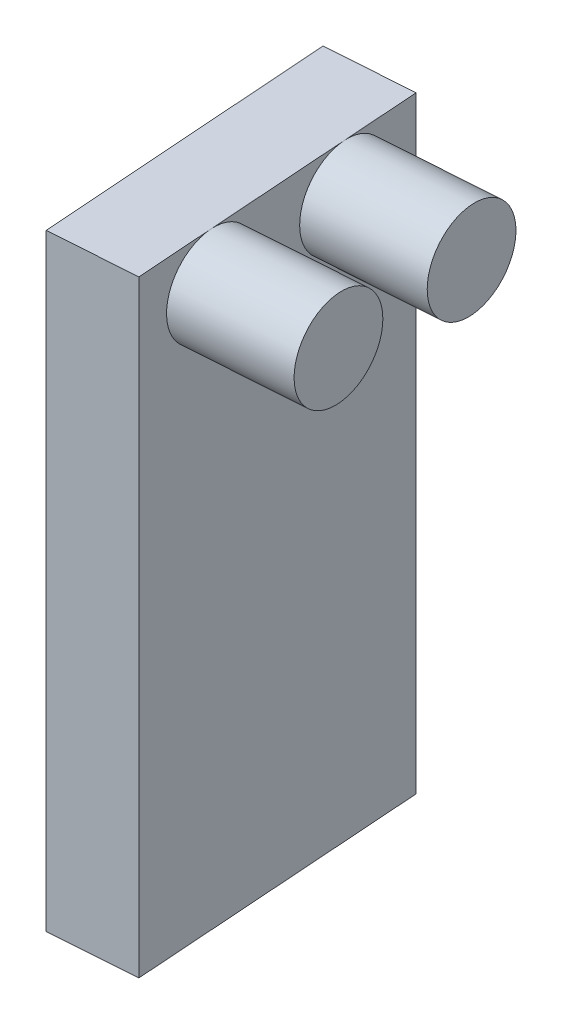
ISO-10303-21;
HEADER;
FILE_DESCRIPTION(('STEP AP214'),'2;1');
FILE_NAME('part.step','',(''),(''),'','','');
FILE_SCHEMA(('AUTOMOTIVE_DESIGN { 1 0 10303 214 1 1 1 1 }'));
ENDSEC;
DATA;
#1=APPLICATION_CONTEXT('core data for automotive mechanical design processes');
#2=APPLICATION_PROTOCOL_DEFINITION('international standard','automotive_design',2000,#1);
#3=PRODUCT_CONTEXT('',#1,'mechanical');
#4=PRODUCT('Part','Part','',(#3));
#5=PRODUCT_RELATED_PRODUCT_CATEGORY('part','',(#4));
#6=PRODUCT_DEFINITION_FORMATION('','',#4);
#7=PRODUCT_DEFINITION_CONTEXT('part definition',#1,'design');
#8=PRODUCT_DEFINITION('design','',#6,#7);
#9=PRODUCT_DEFINITION_SHAPE('','',#8);
#10=(LENGTH_UNIT() NAMED_UNIT(*) SI_UNIT(.MILLI.,.METRE.));
#11=(NAMED_UNIT(*) PLANE_ANGLE_UNIT() SI_UNIT($,.RADIAN.));
#12=(NAMED_UNIT(*) SI_UNIT($,.STERADIAN.) SOLID_ANGLE_UNIT());
#13=UNCERTAINTY_MEASURE_WITH_UNIT(LENGTH_MEASURE(1.E-05),#10,'distance_accuracy_value','');
#14=(GEOMETRIC_REPRESENTATION_CONTEXT(3) GLOBAL_UNCERTAINTY_ASSIGNED_CONTEXT((#13)) GLOBAL_UNIT_ASSIGNED_CONTEXT((#10,
#11,#12)) REPRESENTATION_CONTEXT('',''));
#15=CARTESIAN_POINT('',(0.,0.,0.));
#16=DIRECTION('',(0.,0.,1.));
#17=DIRECTION('',(1.,0.,0.));
#18=AXIS2_PLACEMENT_3D('',#15,#16,#17);
#19=CARTESIAN_POINT('',(0.,25.4,0.));
#20=DIRECTION('',(0.,1.,0.));
#21=DIRECTION('',(0.,0.,1.));
#22=AXIS2_PLACEMENT_3D('',#19,#20,#21);
#23=PLANE('',#22);
#24=DIRECTION('',(-0.0710028791074202,0.,-0.997476110570302));
#25=VECTOR('',#24,1.);
#26=CARTESIAN_POINT('',(130.455463612751,25.4,-9.28615072946733));
#27=LINE('',#26,#25);
#28=CARTESIAN_POINT('',(127.78747707898,25.4,-46.7670650841414));
#29=VERTEX_POINT('',#28);
#30=CARTESIAN_POINT('',(126.899940215872,25.4,-59.2355287482866));
#31=VERTEX_POINT('',#30);
#32=EDGE_CURVE('E55',#29,#31,#27,.T.);
#33=ORIENTED_EDGE('',*,*,#32,.F.);
#34=DIRECTION('',(0.997574787627234,0.,-0.069602752032367));
#35=VECTOR('',#34,1.);
#36=CARTESIAN_POINT('',(131.411983767772,25.4,-47.0199540338509));
#37=LINE('',#36,#35);
#38=CARTESIAN_POINT('',(131.411983767772,25.4,-47.0199540338509));
#39=VERTEX_POINT('',#38);
#40=EDGE_CURVE('E115',#29,#39,#37,.T.);
#41=ORIENTED_EDGE('',*,*,#40,.T.);
#42=DIRECTION('',(-0.0696027520323694,0.,-0.997574787627234));
#43=VECTOR('',#42,1.);
#44=CARTESIAN_POINT('',(130.541949367367,25.4,-59.4896388791913));
#45=LINE('',#44,#43);
#46=CARTESIAN_POINT('',(131.185774823667,25.4,-50.2620720936394));
#47=VERTEX_POINT('',#46);
#48=EDGE_CURVE('E111',#39,#47,#45,.T.);
#49=ORIENTED_EDGE('',*,*,#48,.T.);
#50=CARTESIAN_POINT('',(130.768158311473,25.4,-56.2475208194028));
#51=VERTEX_POINT('',#50);
#52=EDGE_CURVE('E113',#47,#51,#45,.T.);
#53=ORIENTED_EDGE('',*,*,#52,.T.);
#54=CARTESIAN_POINT('',(130.541949367367,25.4,-59.4896388791913));
#55=VERTEX_POINT('',#54);
#56=EDGE_CURVE('E114',#51,#55,#45,.T.);
#57=ORIENTED_EDGE('',*,*,#56,.T.);
#58=DIRECTION('',(-0.997574787627234,0.,0.0696027520323681));
#59=VECTOR('',#58,1.);
#60=CARTESIAN_POINT('',(123.193813481705,25.4,-58.9769450077209));
#61=LINE('',#60,#59);
#62=EDGE_CURVE('E108',#55,#31,#61,.T.);
#63=ORIENTED_EDGE('',*,*,#62,.T.);
#64=EDGE_LOOP('',(#33,#41,#49,#53,#57,#63));
#65=FACE_BOUND('',#64,.T.);
#66=ADVANCED_FACE('F40',(#65),#23,.T.);
#67=CARTESIAN_POINT('',(0.,0.,0.));
#68=DIRECTION('',(0.,1.,0.));
#69=DIRECTION('',(0.,0.,1.));
#70=AXIS2_PLACEMENT_3D('',#67,#68,#69);
#71=PLANE('',#70);
#72=DIRECTION('',(-0.997574787627234,0.,0.069602752032367));
#73=VECTOR('',#72,1.);
#74=CARTESIAN_POINT('',(131.411983767772,0.,-47.0199540338509));
#75=LINE('',#74,#73);
#76=CARTESIAN_POINT('',(131.411983767772,0.,-47.0199540338509));
#77=VERTEX_POINT('',#76);
#78=CARTESIAN_POINT('',(127.78747707898,0.,-46.7670650841414));
#79=VERTEX_POINT('',#78);
#80=EDGE_CURVE('E95',#77,#79,#75,.T.);
#81=ORIENTED_EDGE('',*,*,#80,.T.);
#82=DIRECTION('',(-0.0710028791074202,0.,-0.997476110570302));
#83=VECTOR('',#82,1.);
#84=CARTESIAN_POINT('',(130.455463612751,0.,-9.28615072946733));
#85=LINE('',#84,#83);
#86=CARTESIAN_POINT('',(126.899940215872,0.,-59.2355287482866));
#87=VERTEX_POINT('',#86);
#88=EDGE_CURVE('E98',#79,#87,#85,.T.);
#89=ORIENTED_EDGE('',*,*,#88,.T.);
#90=DIRECTION('',(0.997574787627234,0.,-0.0696027520323681));
#91=VECTOR('',#90,1.);
#92=CARTESIAN_POINT('',(123.193813481705,0.,-58.9769450077209));
#93=LINE('',#92,#91);
#94=CARTESIAN_POINT('',(130.541949367367,0.,-59.4896388791913));
#95=VERTEX_POINT('',#94);
#96=EDGE_CURVE('E86',#87,#95,#93,.T.);
#97=ORIENTED_EDGE('',*,*,#96,.T.);
#98=DIRECTION('',(0.0696027520323694,0.,0.997574787627234));
#99=VECTOR('',#98,1.);
#100=CARTESIAN_POINT('',(130.541949367367,0.,-59.4896388791913));
#101=LINE('',#100,#99);
#102=EDGE_CURVE('E102',#95,#77,#101,.T.);
#103=ORIENTED_EDGE('',*,*,#102,.T.);
#104=EDGE_LOOP('',(#81,#89,#97,#103));
#105=FACE_BOUND('',#104,.T.);
#106=ADVANCED_FACE('F42',(#105),#71,.F.);
#107=CARTESIAN_POINT('',(131.411983767772,-15.3649106732676,-47.0199540338509));
#108=DIRECTION('',(0.069602752032367,0.,0.997574787627234));
#109=DIRECTION('',(0.997574787627234,0.,-0.069602752032367));
#110=AXIS2_PLACEMENT_3D('',#107,#108,#109);
#111=PLANE('',#110);
#112=DIRECTION('',(0.,1.,0.));
#113=VECTOR('',#112,1.);
#114=CARTESIAN_POINT('',(127.78747707898,25.4,-46.7670650841414));
#115=LINE('',#114,#113);
#116=EDGE_CURVE('E12',#79,#29,#115,.T.);
#117=ORIENTED_EDGE('',*,*,#116,.F.);
#118=ORIENTED_EDGE('',*,*,#80,.F.);
#119=DIRECTION('',(0.,1.,0.));
#120=VECTOR('',#119,1.);
#121=CARTESIAN_POINT('',(131.411983767772,-15.3649106732676,-47.0199540338509));
#122=LINE('',#121,#120);
#123=EDGE_CURVE('E105',#77,#39,#122,.T.);
#124=ORIENTED_EDGE('',*,*,#123,.T.);
#125=ORIENTED_EDGE('',*,*,#40,.F.);
#126=EDGE_LOOP('',(#117,#118,#124,#125));
#127=FACE_BOUND('',#126,.T.);
#128=ADVANCED_FACE('F157',(#127),#111,.T.);
#129=CARTESIAN_POINT('',(123.193813481705,-15.3649106732676,-58.9769450077209));
#130=DIRECTION('',(-0.0696027520323681,0.,-0.997574787627234));
#131=DIRECTION('',(-0.997574787627234,0.,0.0696027520323681));
#132=AXIS2_PLACEMENT_3D('',#129,#130,#131);
#133=PLANE('',#132);
#134=DIRECTION('',(0.,-1.,0.));
#135=VECTOR('',#134,1.);
#136=CARTESIAN_POINT('',(126.899940215872,25.4,-59.2355287482866));
#137=LINE('',#136,#135);
#138=EDGE_CURVE('E48',#31,#87,#137,.T.);
#139=ORIENTED_EDGE('',*,*,#138,.F.);
#140=ORIENTED_EDGE('',*,*,#62,.F.);
#141=DIRECTION('',(0.,1.,0.));
#142=VECTOR('',#141,1.);
#143=CARTESIAN_POINT('',(130.541949367367,-15.3649106732676,-59.4896388791913));
#144=LINE('',#143,#142);
#145=EDGE_CURVE('E92',#95,#55,#144,.T.);
#146=ORIENTED_EDGE('',*,*,#145,.F.);
#147=ORIENTED_EDGE('',*,*,#96,.F.);
#148=EDGE_LOOP('',(#139,#140,#146,#147));
#149=FACE_BOUND('',#148,.T.);
#150=ADVANCED_FACE('F88',(#149),#133,.T.);
#151=CARTESIAN_POINT('',(130.541949367367,-15.3649106732676,-59.4896388791913));
#152=DIRECTION('',(0.997574787627234,0.,-0.0696027520323694));
#153=DIRECTION('',(-0.0696027520323694,0.,-0.997574787627234));
#154=AXIS2_PLACEMENT_3D('',#151,#152,#153);
#155=PLANE('',#154);
#156=ORIENTED_EDGE('',*,*,#56,.F.);
#157=CARTESIAN_POINT('',(130.768158311473,23.4,-56.2475208194028));
#158=DIRECTION('',(-0.997574787627234,0.,0.0696027520323694));
#159=DIRECTION('',(0.0696027520323694,0.,0.997574787627234));
#160=AXIS2_PLACEMENT_3D('',#157,#158,#159);
#161=CIRCLE('',#160,2.);
#162=EDGE_CURVE('E122',#51,#51,#161,.T.);
#163=ORIENTED_EDGE('',*,*,#162,.T.);
#164=ORIENTED_EDGE('',*,*,#52,.F.);
#165=CARTESIAN_POINT('',(131.185774823667,23.4,-50.2620720936394));
#166=DIRECTION('',(0.997574787627234,0.,-0.0696027520323694));
#167=DIRECTION('',(-0.0696027520323694,0.,-0.997574787627234));
#168=AXIS2_PLACEMENT_3D('',#165,#166,#167);
#169=CIRCLE('',#168,2.00000000000001);
#170=EDGE_CURVE('E119',#47,#47,#169,.T.);
#171=ORIENTED_EDGE('',*,*,#170,.F.);
#172=ORIENTED_EDGE('',*,*,#48,.F.);
#173=ORIENTED_EDGE('',*,*,#123,.F.);
#174=ORIENTED_EDGE('',*,*,#102,.F.);
#175=ORIENTED_EDGE('',*,*,#145,.T.);
#176=EDGE_LOOP('',(#156,#163,#164,#171,#172,#173,#174,#175));
#177=FACE_BOUND('',#176,.T.);
#178=ADVANCED_FACE('F134',(#177),#155,.T.);
#179=CARTESIAN_POINT('',(136.173648761803,23.4,-50.6100858538012));
#180=DIRECTION('',(-0.997574787627234,0.,0.0696027520323694));
#181=DIRECTION('',(0.0696027520323694,0.,0.997574787627234));
#182=AXIS2_PLACEMENT_3D('',#179,#180,#181);
#183=CYLINDRICAL_SURFACE('',#182,2.00000000000001);
#184=CARTESIAN_POINT('',(136.173648761803,23.4,-50.6100858538012));
#185=DIRECTION('',(0.997574787627234,0.,-0.0696027520323694));
#186=DIRECTION('',(-0.0696027520323694,0.,-0.997574787627234));
#187=AXIS2_PLACEMENT_3D('',#184,#185,#186);
#188=CIRCLE('',#187,2.00000000000001);
#189=CARTESIAN_POINT('',(136.034443257738,23.4,-52.6052354290557));
#190=VERTEX_POINT('',#189);
#191=EDGE_CURVE('E117',#190,#190,#188,.T.);
#192=ORIENTED_EDGE('',*,*,#191,.F.);
#193=EDGE_LOOP('',(#192));
#194=FACE_BOUND('',#193,.T.);
#195=ORIENTED_EDGE('',*,*,#170,.T.);
#196=EDGE_LOOP('',(#195));
#197=FACE_BOUND('',#196,.T.);
#198=ADVANCED_FACE('F149',(#194,#197),#183,.T.);
#199=CARTESIAN_POINT('',(136.173648761803,23.4,-50.6100858538012));
#200=DIRECTION('',(0.997574787627234,0.,-0.0696027520323694));
#201=DIRECTION('',(-0.0696027520323694,0.,-0.997574787627234));
#202=AXIS2_PLACEMENT_3D('',#199,#200,#201);
#203=PLANE('',#202);
#204=ORIENTED_EDGE('',*,*,#191,.T.);
#205=EDGE_LOOP('',(#204));
#206=FACE_BOUND('',#205,.T.);
#207=ADVANCED_FACE('F140',(#206),#203,.T.);
#208=CARTESIAN_POINT('',(135.756032249609,23.4,-56.5955345795646));
#209=DIRECTION('',(-0.997574787627234,0.,0.0696027520323694));
#210=DIRECTION('',(0.0696027520323694,0.,0.997574787627234));
#211=AXIS2_PLACEMENT_3D('',#208,#209,#210);
#212=CYLINDRICAL_SURFACE('',#211,2.);
#213=CARTESIAN_POINT('',(135.756032249609,23.4,-56.5955345795646));
#214=DIRECTION('',(-0.997574787627234,0.,0.0696027520323694));
#215=DIRECTION('',(0.0696027520323694,0.,0.997574787627234));
#216=AXIS2_PLACEMENT_3D('',#213,#214,#215);
#217=CIRCLE('',#216,2.);
#218=CARTESIAN_POINT('',(135.895237753674,23.4,-54.6003850043101));
#219=VERTEX_POINT('',#218);
#220=EDGE_CURVE('E125',#219,#219,#217,.T.);
#221=ORIENTED_EDGE('',*,*,#220,.T.);
#222=EDGE_LOOP('',(#221));
#223=FACE_BOUND('',#222,.T.);
#224=ORIENTED_EDGE('',*,*,#162,.F.);
#225=EDGE_LOOP('',(#224));
#226=FACE_BOUND('',#225,.T.);
#227=ADVANCED_FACE('F137',(#223,#226),#212,.T.);
#228=CARTESIAN_POINT('',(135.756032249609,23.4,-56.5955345795646));
#229=DIRECTION('',(-0.997574787627234,0.,0.0696027520323694));
#230=DIRECTION('',(0.0696027520323694,0.,0.997574787627234));
#231=AXIS2_PLACEMENT_3D('',#228,#229,#230);
#232=PLANE('',#231);
#233=ORIENTED_EDGE('',*,*,#220,.F.);
#234=EDGE_LOOP('',(#233));
#235=FACE_BOUND('',#234,.T.);
#236=ADVANCED_FACE('F139',(#235),#232,.F.);
#237=CARTESIAN_POINT('',(130.455463612751,0.,-9.28615072946733));
#238=DIRECTION('',(0.997476110570302,0.,-0.0710028791074202));
#239=DIRECTION('',(-0.0710028791074202,0.,-0.997476110570302));
#240=AXIS2_PLACEMENT_3D('',#237,#238,#239);
#241=PLANE('',#240);
#242=ORIENTED_EDGE('',*,*,#88,.F.);
#243=ORIENTED_EDGE('',*,*,#116,.T.);
#244=ORIENTED_EDGE('',*,*,#32,.T.);
#245=ORIENTED_EDGE('',*,*,#138,.T.);
#246=EDGE_LOOP('',(#242,#243,#244,#245));
#247=FACE_BOUND('',#246,.T.);
#248=ADVANCED_FACE('F101',(#247),#241,.F.);
#249=CLOSED_SHELL('',(#66,#106,#128,#150,#178,#198,#207,#227,#236,#248));
#250=MANIFOLD_SOLID_BREP('B2',#249);
#251=ADVANCED_BREP_SHAPE_REPRESENTATION('',(#18,#250),#14);
#252=SHAPE_DEFINITION_REPRESENTATION(#9,#251);
ENDSEC;
END-ISO-10303-21;
